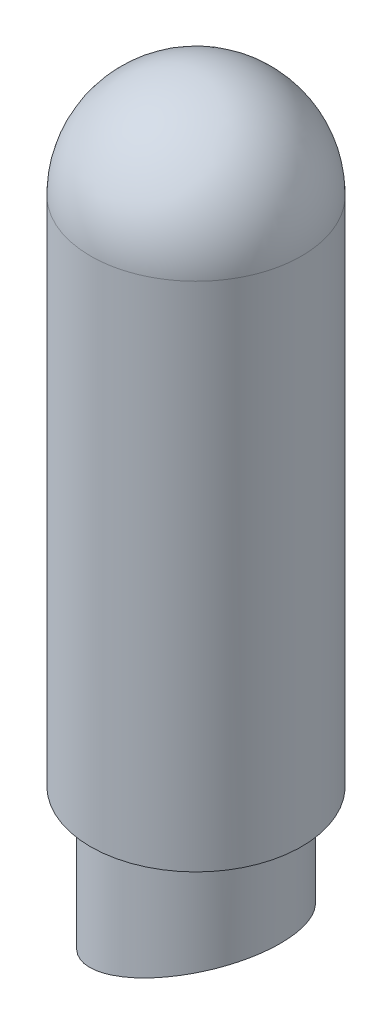
ISO-10303-21;
HEADER;
FILE_DESCRIPTION(('STEP AP214'),'2;1');
FILE_NAME('part.step','',(''),(''),'','','');
FILE_SCHEMA(('AUTOMOTIVE_DESIGN { 1 0 10303 214 1 1 1 1 }'));
ENDSEC;
DATA;
#1=APPLICATION_CONTEXT('core data for automotive mechanical design processes');
#2=APPLICATION_PROTOCOL_DEFINITION('international standard','automotive_design',2000,#1);
#3=PRODUCT_CONTEXT('',#1,'mechanical');
#4=PRODUCT('Part','Part','',(#3));
#5=PRODUCT_RELATED_PRODUCT_CATEGORY('part','',(#4));
#6=PRODUCT_DEFINITION_FORMATION('','',#4);
#7=PRODUCT_DEFINITION_CONTEXT('part definition',#1,'design');
#8=PRODUCT_DEFINITION('design','',#6,#7);
#9=PRODUCT_DEFINITION_SHAPE('','',#8);
#10=(LENGTH_UNIT() NAMED_UNIT(*) SI_UNIT(.MILLI.,.METRE.));
#11=(NAMED_UNIT(*) PLANE_ANGLE_UNIT() SI_UNIT($,.RADIAN.));
#12=(NAMED_UNIT(*) SI_UNIT($,.STERADIAN.) SOLID_ANGLE_UNIT());
#13=UNCERTAINTY_MEASURE_WITH_UNIT(LENGTH_MEASURE(1.E-05),#10,'distance_accuracy_value','');
#14=(GEOMETRIC_REPRESENTATION_CONTEXT(3) GLOBAL_UNCERTAINTY_ASSIGNED_CONTEXT((#13)) GLOBAL_UNIT_ASSIGNED_CONTEXT((#10,
#11,#12)) REPRESENTATION_CONTEXT('',''));
#15=CARTESIAN_POINT('',(0.,0.,0.));
#16=DIRECTION('',(0.,0.,1.));
#17=DIRECTION('',(1.,0.,0.));
#18=AXIS2_PLACEMENT_3D('',#15,#16,#17);
#19=CARTESIAN_POINT('',(14.2136699442785,4.61830132064976,0.));
#20=DIRECTION('',(-0.309016994374948,0.951056516295154,0.));
#21=DIRECTION('',(-0.951056516295154,-0.309016994374948,0.));
#22=AXIS2_PLACEMENT_3D('',#19,#20,#21);
#23=PLANE('',#22);
#24=CARTESIAN_POINT('',(6.35,2.06324007107895,0.));
#25=DIRECTION('',(-0.309016994374948,0.951056516295154,0.));
#26=DIRECTION('',(0.951056516295154,0.309016994374948,0.));
#27=AXIS2_PLACEMENT_3D('',#24,#25,#26);
#28=ELLIPSE('',#27,6.676785123913,6.35);
#29=CARTESIAN_POINT('',(12.7,4.12648014215791,0.));
#30=VERTEX_POINT('',#29);
#31=EDGE_CURVE('E20',#30,#30,#28,.T.);
#32=ORIENTED_EDGE('',*,*,#31,.F.);
#33=EDGE_LOOP('',(#32));
#34=FACE_BOUND('',#33,.T.);
#35=ADVANCED_FACE('F17',(#34),#23,.F.);
#36=CARTESIAN_POINT('',(6.35,5.61011059831039,0.));
#37=DIRECTION('',(0.,1.,0.));
#38=DIRECTION('',(0.,0.,1.));
#39=AXIS2_PLACEMENT_3D('',#36,#37,#38);
#40=CYLINDRICAL_SURFACE('',#39,6.35);
#41=CARTESIAN_POINT('',(6.35,11.2202211966208,0.));
#42=DIRECTION('',(0.,1.,0.));
#43=DIRECTION('',(0.,0.,1.));
#44=AXIS2_PLACEMENT_3D('',#41,#42,#43);
#45=CIRCLE('',#44,6.35);
#46=CARTESIAN_POINT('',(6.35,11.2202211966208,6.35));
#47=VERTEX_POINT('',#46);
#48=EDGE_CURVE('E49',#47,#47,#45,.T.);
#49=ORIENTED_EDGE('',*,*,#48,.F.);
#50=EDGE_LOOP('',(#49));
#51=FACE_BOUND('',#50,.T.);
#52=ORIENTED_EDGE('',*,*,#31,.T.);
#53=EDGE_LOOP('',(#52));
#54=FACE_BOUND('',#53,.T.);
#55=ADVANCED_FACE('F41',(#51,#54),#40,.T.);
#56=CARTESIAN_POINT('',(13.49375,11.2202211966208,0.));
#57=DIRECTION('',(0.,-1.,0.));
#58=DIRECTION('',(0.,0.,-1.));
#59=AXIS2_PLACEMENT_3D('',#56,#57,#58);
#60=PLANE('',#59);
#61=ORIENTED_EDGE('',*,*,#48,.T.);
#62=EDGE_LOOP('',(#61));
#63=FACE_BOUND('',#62,.T.);
#64=CARTESIAN_POINT('',(6.35000000000001,11.2202211966208,0.));
#65=DIRECTION('',(0.,1.,0.));
#66=DIRECTION('',(0.,0.,1.));
#67=AXIS2_PLACEMENT_3D('',#64,#65,#66);
#68=CIRCLE('',#67,7.9375);
#69=CARTESIAN_POINT('',(6.35000000000001,11.2202211966208,7.93749999999999));
#70=VERTEX_POINT('',#69);
#71=EDGE_CURVE('E24',#70,#70,#68,.T.);
#72=ORIENTED_EDGE('',*,*,#71,.F.);
#73=EDGE_LOOP('',(#72));
#74=FACE_BOUND('',#73,.T.);
#75=ADVANCED_FACE('F31',(#63,#74),#60,.T.);
#76=CARTESIAN_POINT('',(6.35,49.7028776998712,0.));
#77=DIRECTION('',(0.693125124231854,0.712399383915144,0.109839337015022));
#78=DIRECTION('',(-0.29634544015385,0.420540648268777,-0.857510899787109));
#79=AXIS2_PLACEMENT_3D('',#76,#77,#78);
#80=SPHERICAL_SURFACE('',#79,7.9375);
#81=CARTESIAN_POINT('',(6.34999999999999,49.7028776998712,0.));
#82=DIRECTION('',(0.,1.,0.));
#83=DIRECTION('',(0.,0.,1.));
#84=AXIS2_PLACEMENT_3D('',#81,#82,#83);
#85=CIRCLE('',#84,7.9375);
#86=CARTESIAN_POINT('',(6.34999999999999,49.7028776998712,7.93750000000001));
#87=VERTEX_POINT('',#86);
#88=EDGE_CURVE('E11',#87,#87,#85,.F.);
#89=ORIENTED_EDGE('',*,*,#88,.F.);
#90=EDGE_LOOP('',(#89));
#91=FACE_BOUND('',#90,.T.);
#92=CARTESIAN_POINT('',(11.8516806735903,55.3575478096977,0.871849737556786));
#93=VERTEX_POINT('',#92);
#94=VERTEX_LOOP('',#93);
#95=FACE_BOUND('',#94,.T.);
#96=ADVANCED_FACE('F28',(#91,#95),#80,.T.);
#97=CARTESIAN_POINT('',(6.35,30.461549448246,0.));
#98=DIRECTION('',(0.,1.,0.));
#99=DIRECTION('',(0.,0.,1.));
#100=AXIS2_PLACEMENT_3D('',#97,#98,#99);
#101=CYLINDRICAL_SURFACE('',#100,7.9375);
#102=ORIENTED_EDGE('',*,*,#71,.T.);
#103=EDGE_LOOP('',(#102));
#104=FACE_BOUND('',#103,.T.);
#105=ORIENTED_EDGE('',*,*,#88,.T.);
#106=EDGE_LOOP('',(#105));
#107=FACE_BOUND('',#106,.T.);
#108=ADVANCED_FACE('F30',(#104,#107),#101,.T.);
#109=CLOSED_SHELL('',(#35,#55,#75,#96,#108));
#110=MANIFOLD_SOLID_BREP('B1',#109);
#111=ADVANCED_BREP_SHAPE_REPRESENTATION('',(#18,#110),#14);
#112=SHAPE_DEFINITION_REPRESENTATION(#9,#111);
ENDSEC;
END-ISO-10303-21;
